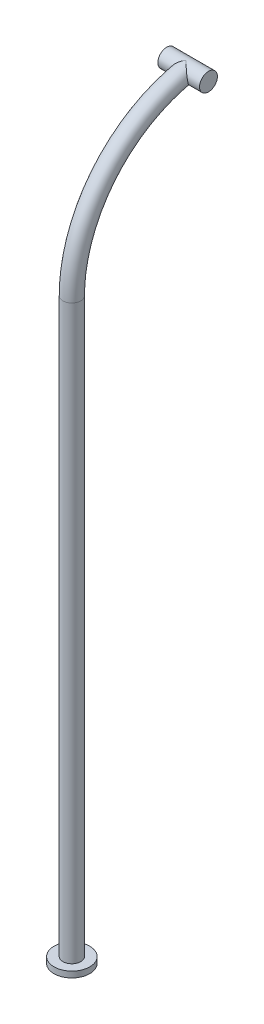
ISO-10303-21;
HEADER;
FILE_DESCRIPTION(('STEP AP214'),'2;1');
FILE_NAME('part.step','',(''),(''),'','','');
FILE_SCHEMA(('AUTOMOTIVE_DESIGN { 1 0 10303 214 1 1 1 1 }'));
ENDSEC;
DATA;
#1=APPLICATION_CONTEXT('core data for automotive mechanical design processes');
#2=APPLICATION_PROTOCOL_DEFINITION('international standard','automotive_design',2000,#1);
#3=PRODUCT_CONTEXT('',#1,'mechanical');
#4=PRODUCT('Part','Part','',(#3));
#5=PRODUCT_RELATED_PRODUCT_CATEGORY('part','',(#4));
#6=PRODUCT_DEFINITION_FORMATION('','',#4);
#7=PRODUCT_DEFINITION_CONTEXT('part definition',#1,'design');
#8=PRODUCT_DEFINITION('design','',#6,#7);
#9=PRODUCT_DEFINITION_SHAPE('','',#8);
#10=(LENGTH_UNIT() NAMED_UNIT(*) SI_UNIT(.MILLI.,.METRE.));
#11=(NAMED_UNIT(*) PLANE_ANGLE_UNIT() SI_UNIT($,.RADIAN.));
#12=(NAMED_UNIT(*) SI_UNIT($,.STERADIAN.) SOLID_ANGLE_UNIT());
#13=UNCERTAINTY_MEASURE_WITH_UNIT(LENGTH_MEASURE(1.E-05),#10,'distance_accuracy_value','');
#14=(GEOMETRIC_REPRESENTATION_CONTEXT(3) GLOBAL_UNCERTAINTY_ASSIGNED_CONTEXT((#13)) GLOBAL_UNIT_ASSIGNED_CONTEXT((#10,
#11,#12)) REPRESENTATION_CONTEXT('',''));
#15=CARTESIAN_POINT('',(0.,0.,0.));
#16=DIRECTION('',(0.,0.,1.));
#17=DIRECTION('',(1.,0.,0.));
#18=AXIS2_PLACEMENT_3D('',#15,#16,#17);
#19=CARTESIAN_POINT('',(0.,96.,0.));
#20=DIRECTION('',(0.,-1.,0.));
#21=DIRECTION('',(0.,0.,-1.));
#22=AXIS2_PLACEMENT_3D('',#19,#20,#21);
#23=CYLINDRICAL_SURFACE('',#22,1.5);
#24=CARTESIAN_POINT('',(0.,96.,0.));
#25=DIRECTION('',(0.,1.,0.));
#26=DIRECTION('',(0.,0.,1.));
#27=AXIS2_PLACEMENT_3D('',#24,#25,#26);
#28=CIRCLE('',#27,1.5);
#29=CARTESIAN_POINT('',(0.,96.,1.5));
#30=VERTEX_POINT('',#29);
#31=EDGE_CURVE('E11',#30,#30,#28,.T.);
#32=ORIENTED_EDGE('',*,*,#31,.F.);
#33=EDGE_LOOP('',(#32));
#34=FACE_BOUND('',#33,.T.);
#35=CARTESIAN_POINT('',(0.,0.,0.));
#36=DIRECTION('',(0.,1.,0.));
#37=DIRECTION('',(0.,0.,1.));
#38=AXIS2_PLACEMENT_3D('',#35,#36,#37);
#39=CIRCLE('',#38,1.5);
#40=CARTESIAN_POINT('',(0.,0.,1.5));
#41=VERTEX_POINT('',#40);
#42=EDGE_CURVE('E38',#41,#41,#39,.T.);
#43=ORIENTED_EDGE('',*,*,#42,.T.);
#44=EDGE_LOOP('',(#43));
#45=FACE_BOUND('',#44,.T.);
#46=ADVANCED_FACE('F35',(#34,#45),#23,.T.);
#47=CARTESIAN_POINT('',(0.,-1.,0.));
#48=DIRECTION('',(0.,1.,0.));
#49=DIRECTION('',(0.,0.,1.));
#50=AXIS2_PLACEMENT_3D('',#47,#48,#49);
#51=CYLINDRICAL_SURFACE('',#50,3.);
#52=CARTESIAN_POINT('',(0.,-1.,0.));
#53=DIRECTION('',(0.,-1.,0.));
#54=DIRECTION('',(0.,0.,-1.));
#55=AXIS2_PLACEMENT_3D('',#52,#53,#54);
#56=CIRCLE('',#55,3.);
#57=CARTESIAN_POINT('',(0.,-1.,-3.));
#58=VERTEX_POINT('',#57);
#59=EDGE_CURVE('E60',#58,#58,#56,.T.);
#60=ORIENTED_EDGE('',*,*,#59,.F.);
#61=EDGE_LOOP('',(#60));
#62=FACE_BOUND('',#61,.T.);
#63=CARTESIAN_POINT('',(0.,0.,0.));
#64=DIRECTION('',(0.,-1.,0.));
#65=DIRECTION('',(0.,0.,-1.));
#66=AXIS2_PLACEMENT_3D('',#63,#64,#65);
#67=CIRCLE('',#66,3.);
#68=CARTESIAN_POINT('',(0.,0.,-3.));
#69=VERTEX_POINT('',#68);
#70=EDGE_CURVE('E57',#69,#69,#67,.T.);
#71=ORIENTED_EDGE('',*,*,#70,.T.);
#72=EDGE_LOOP('',(#71));
#73=FACE_BOUND('',#72,.T.);
#74=ADVANCED_FACE('F90',(#62,#73),#51,.T.);
#75=CARTESIAN_POINT('',(0.,-1.,0.));
#76=DIRECTION('',(0.,-1.,0.));
#77=DIRECTION('',(0.,0.,-1.));
#78=AXIS2_PLACEMENT_3D('',#75,#76,#77);
#79=PLANE('',#78);
#80=ORIENTED_EDGE('',*,*,#59,.T.);
#81=EDGE_LOOP('',(#80));
#82=FACE_BOUND('',#81,.T.);
#83=ADVANCED_FACE('F95',(#82),#79,.T.);
#84=CARTESIAN_POINT('',(0.,0.,0.));
#85=DIRECTION('',(0.,-1.,0.));
#86=DIRECTION('',(0.,0.,-1.));
#87=AXIS2_PLACEMENT_3D('',#84,#85,#86);
#88=PLANE('',#87);
#89=ORIENTED_EDGE('',*,*,#42,.F.);
#90=EDGE_LOOP('',(#89));
#91=FACE_BOUND('',#90,.T.);
#92=ORIENTED_EDGE('',*,*,#70,.F.);
#93=EDGE_LOOP('',(#92));
#94=FACE_BOUND('',#93,.T.);
#95=ADVANCED_FACE('F108',(#91,#94),#88,.F.);
#96=CARTESIAN_POINT('',(0.,96.,-23.5));
#97=DIRECTION('',(1.,0.,0.));
#98=DIRECTION('',(0.,0.,-1.));
#99=AXIS2_PLACEMENT_3D('',#96,#97,#98);
#100=TOROIDAL_SURFACE('',#99,23.5,1.5);
#101=CARTESIAN_POINT('',(0.,120.620193825305,-19.1587955583268));
#102=CARTESIAN_POINT('',(-0.0018537052535478,120.619861811997,-19.1569126554162));
#103=CARTESIAN_POINT('',(-0.00370746798024509,120.619526195106,-19.1550303276243));
#104=CARTESIAN_POINT('',(-0.115881057773662,120.599000089099,-19.0411666480332));
#105=CARTESIAN_POINT('',(-0.226377501892855,120.566052234373,-18.9312538632642));
#106=CARTESIAN_POINT('',(-0.444772916299563,120.474622358396,-18.719185892713));
#107=CARTESIAN_POINT('',(-0.552665436072186,120.416082668296,-18.6170488427425));
#108=CARTESIAN_POINT('',(-0.734320155371233,120.291643885346,-18.450591252963));
#109=CARTESIAN_POINT('',(-0.809576325178854,120.231762220571,-18.3834034109835));
#110=CARTESIAN_POINT('',(-0.954392096067578,120.097278091331,-18.2583525801813));
#111=CARTESIAN_POINT('',(-1.02396394077776,120.022708513128,-18.2004692749422));
#112=CARTESIAN_POINT('',(-1.13745535009243,119.879851990233,-18.1107660185354));
#113=CARTESIAN_POINT('',(-1.18335127624714,119.814942007049,-18.0760787666043));
#114=CARTESIAN_POINT('',(-1.26851571888151,119.677082479366,-18.0155642587893));
#115=CARTESIAN_POINT('',(-1.30779253587496,119.604143196543,-17.9897258636069));
#116=CARTESIAN_POINT('',(-1.370200858334,119.466918252286,-17.9533155103886));
#117=CARTESIAN_POINT('',(-1.39499155518931,119.403937274703,-17.9406968609073));
#118=CARTESIAN_POINT('',(-1.43752022044973,119.274542506387,-17.9236276863551));
#119=CARTESIAN_POINT('',(-1.45526275956153,119.208130972044,-17.9191718609258));
#120=CARTESIAN_POINT('',(-1.48246750306033,119.073069266053,-17.9193675436886));
#121=CARTESIAN_POINT('',(-1.49186701760018,119.004406100137,-17.9240871666456));
#122=CARTESIAN_POINT('',(-1.50120471128907,118.867772155485,-17.9431220038185));
#123=CARTESIAN_POINT('',(-1.5011487811936,118.799800972044,-17.9574312381576));
#124=CARTESIAN_POINT('',(-1.49206503096275,118.675146340182,-17.9927974484165));
#125=CARTESIAN_POINT('',(-1.48411659008736,118.618088240753,-18.0128364353358));
#126=CARTESIAN_POINT('',(-1.46132153450782,118.507972494756,-18.0590001867476));
#127=CARTESIAN_POINT('',(-1.44647398975484,118.454915388671,-18.0851257715204));
#128=CARTESIAN_POINT('',(-1.41025341699855,118.352460291901,-18.1430884490756));
#129=CARTESIAN_POINT('',(-1.38871871218166,118.303195601842,-18.1750579301856));
#130=CARTESIAN_POINT('',(-1.34033809671886,118.210406190437,-18.242996192529));
#131=CARTESIAN_POINT('',(-1.31348966141162,118.166884214017,-18.278966871241));
#132=CARTESIAN_POINT('',(-1.23969169167345,118.063530443827,-18.3742498913955));
#133=CARTESIAN_POINT('',(-1.18975434313812,118.007711842341,-18.4356120184566));
#134=CARTESIAN_POINT('',(-1.08267213410527,117.909140910077,-18.5624589673256));
#135=CARTESIAN_POINT('',(-1.02550803418719,117.86642454109,-18.6279545513095));
#136=CARTESIAN_POINT('',(-0.881553762660521,117.777739851887,-18.788650154918));
#137=CARTESIAN_POINT('',(-0.79229561778328,117.737745772154,-18.8849227914431));
#138=CARTESIAN_POINT('',(-0.608208741647366,117.678737759365,-19.0783531238493));
#139=CARTESIAN_POINT('',(-0.513376598013452,117.659736822114,-19.1755113304673));
#140=CARTESIAN_POINT('',(-0.349423328825955,117.643519449176,-19.340090213541));
#141=CARTESIAN_POINT('',(-0.281002385861977,117.64151895342,-19.4077989140209));
#142=CARTESIAN_POINT('',(-0.143563831408559,117.646512541199,-19.5420846724762));
#143=CARTESIAN_POINT('',(-0.0745474755515862,117.653490869675,-19.6086635055255));
#144=CARTESIAN_POINT('',(-0.00371115619363194,117.665150215364,-19.6762033204509));
#145=CARTESIAN_POINT('',(-0.0018555613702252,117.66545880869,-19.6779720012932));
#146=CARTESIAN_POINT('',(0.,117.665770566269,-19.6797400913276));
#147=B_SPLINE_CURVE_WITH_KNOTS('',3,(#101,#102,#103,#104,#105,#106,#107,#108,#109,#110,#111,
#112,#113,#114,#115,#116,#117,#118,#119,#120,#121,#122,#123,#124,#125,#126,#127,#128,#129,#130,
#131,#132,#133,#134,#135,#136,#137,#138,#139,#140,#141,#142,#143,#144,#145,#146),.UNSPECIFIED.,
.F.,.F.,(4,2,2,2,2,2,2,2,2,2,2,2,2,2,2,2,2,2,2,2,2,2,4),(0.,0.00798936214706331,
0.483433668523633,0.959954912275898,1.31074225810984,1.66075294007193,1.9200896299772,
2.17909864592695,2.38484781402027,2.59046333579286,2.79761109261149,3.00462979655792,
3.1867613964182,3.36891755605437,3.55587477748474,3.74292104025734,4.03175669373832,
4.32137816528414,4.73089511210548,5.14066542860265,5.42911908157095,5.71706727723055,
5.72481324995939),.UNSPECIFIED.);
#148=CARTESIAN_POINT('',(0.,120.620193825305,-19.1587955583268));
#149=VERTEX_POINT('',#148);
#150=CARTESIAN_POINT('',(0.,117.665770566269,-19.6797400913276));
#151=VERTEX_POINT('',#150);
#152=EDGE_CURVE('E50',#149,#151,#147,.T.);
#153=ORIENTED_EDGE('',*,*,#152,.T.);
#154=CARTESIAN_POINT('',(0.,117.665770566269,-19.6797400913276));
#155=CARTESIAN_POINT('',(0.00185551671662992,117.665458822323,-19.6779720428394));
#156=CARTESIAN_POINT('',(0.00371111186187556,117.665150228725,-19.6762033617294));
#157=CARTESIAN_POINT('',(0.12602131042256,117.645018109903,-19.5595851690684));
#158=CARTESIAN_POINT('',(0.246770009248978,117.638477851673,-19.4420989575472));
#159=CARTESIAN_POINT('',(0.424986802578416,117.649807022725,-19.2644784068306));
#160=CARTESIAN_POINT('',(0.48399809905577,117.657134790076,-19.2049454088842));
#161=CARTESIAN_POINT('',(0.600499902060489,117.67926655826,-19.0857966125935));
#162=CARTESIAN_POINT('',(0.657991376611415,117.694065673414,-19.0261808937156));
#163=CARTESIAN_POINT('',(0.788185045789324,117.737459646485,-18.8890175035039));
#164=CARTESIAN_POINT('',(0.860113578591412,117.768900775206,-18.8116065409692));
#165=CARTESIAN_POINT('',(0.997981398084005,117.846963966027,-18.6592420316256));
#166=CARTESIAN_POINT('',(1.06393382962462,117.893551622103,-18.5842833351729));
#167=CARTESIAN_POINT('',(1.17144756656531,117.989855276253,-18.4575233246697));
#168=CARTESIAN_POINT('',(1.21498662401479,118.035883616443,-18.4046142493622));
#169=CARTESIAN_POINT('',(1.29511239442943,118.138016435008,-18.3033852553755));
#170=CARTESIAN_POINT('',(1.33170782286599,118.194108107671,-18.2550596223125));
#171=CARTESIAN_POINT('',(1.38932043184395,118.304152186474,-18.174256195726));
#172=CARTESIAN_POINT('',(1.41198789127558,118.356320267771,-18.1405365510623));
#173=CARTESIAN_POINT('',(1.45013986733255,118.466472054275,-18.0790054925247));
#174=CARTESIAN_POINT('',(1.46562951700792,118.524451567366,-18.0511898642644));
#175=CARTESIAN_POINT('',(1.48845117293184,118.645292682077,-18.0027358152113));
#176=CARTESIAN_POINT('',(1.4957354808542,118.708180580152,-17.9821398346347));
#177=CARTESIAN_POINT('',(1.50146155242806,118.83651192316,-17.9494186927207));
#178=CARTESIAN_POINT('',(1.49990519431048,118.90195482234,-17.9372917327245));
#179=CARTESIAN_POINT('',(1.48875406484943,119.026994290206,-17.9225570181584));
#180=CARTESIAN_POINT('',(1.4799158603276,119.086571926392,-17.9191727631652));
#181=CARTESIAN_POINT('',(1.455835607311,119.204383056781,-17.919367037355));
#182=CARTESIAN_POINT('',(1.44059247214326,119.262616321126,-17.9229467484321));
#183=CARTESIAN_POINT('',(1.40345802837158,119.380139159514,-17.9368788782709));
#184=CARTESIAN_POINT('',(1.38120881430048,119.439264723177,-17.9476431956137));
#185=CARTESIAN_POINT('',(1.33160276723544,119.55376153232,-17.9754056116038));
#186=CARTESIAN_POINT('',(1.30424295874169,119.609130564934,-17.9924073474002));
#187=CARTESIAN_POINT('',(1.22943222577785,119.744579954342,-18.0424045343333));
#188=CARTESIAN_POINT('',(1.17914030804177,119.821747643954,-18.0790712503376));
#189=CARTESIAN_POINT('',(1.07172665770131,119.965425688383,-18.1620865204402));
#190=CARTESIAN_POINT('',(1.01458808435472,120.031908782353,-18.2084591662491));
#191=CARTESIAN_POINT('',(0.874627311643324,120.175811239849,-18.3262465951938));
#192=CARTESIAN_POINT('',(0.789854153097809,120.248818069592,-18.4007252282576));
#193=CARTESIAN_POINT('',(0.615284337005814,120.376015811099,-18.5590636238579));
#194=CARTESIAN_POINT('',(0.525484849331907,120.430195996028,-18.6429286986395));
#195=CARTESIAN_POINT('',(0.363888887597706,120.510106678053,-18.797399522479));
#196=CARTESIAN_POINT('',(0.292619514576809,120.539501096165,-18.8667083673093));
#197=CARTESIAN_POINT('',(0.149402808833266,120.587452983427,-19.0080961851971));
#198=CARTESIAN_POINT('',(0.0774570219428874,120.606030941486,-19.0801696434429));
#199=CARTESIAN_POINT('',(0.00370748452012608,120.619526196649,-19.1550303099391));
#200=CARTESIAN_POINT('',(0.0018537217189263,120.619861813736,-19.1569126377718));
#201=CARTESIAN_POINT('',(0.,120.620193825305,-19.1587955583268));
#202=B_SPLINE_CURVE_WITH_KNOTS('',3,(#154,#155,#156,#157,#158,#159,#160,#161,#162,#163,#164,
#165,#166,#167,#168,#169,#170,#171,#172,#173,#174,#175,#176,#177,#178,#179,#180,#181,#182,#183,
#184,#185,#186,#187,#188,#189,#190,#191,#192,#193,#194,#195,#196,#197,#198,#199,#200,#201),
.UNSPECIFIED.,.F.,.F.,(4,2,2,2,2,2,2,2,2,2,2,2,2,2,2,2,2,2,2,2,2,2,2,4),(0.,0.00774597272883874,
0.510550925507701,0.762744102519317,1.0147725780536,1.34448431879618,1.67345227677967,
1.92025492326559,2.16674570967238,2.36432239054724,2.56175755999878,2.7603346072177,
2.95886946761519,3.13904707804884,3.31925527011691,3.51080021272671,3.70245702657631,
3.9982127697321,4.29471152310557,4.69578076395294,5.09707814829994,5.40751942146165,
5.71737071669235,5.72536007883942),.UNSPECIFIED.);
#203=EDGE_CURVE('E48',#151,#149,#202,.T.);
#204=ORIENTED_EDGE('',*,*,#203,.T.);
#205=EDGE_LOOP('',(#153,#204));
#206=FACE_BOUND('',#205,.T.);
#207=ORIENTED_EDGE('',*,*,#31,.T.);
#208=EDGE_LOOP('',(#207));
#209=FACE_BOUND('',#208,.T.);
#210=ADVANCED_FACE('F55',(#206,#209),#100,.T.);
#211=CARTESIAN_POINT('',(-3.5,119.142982195787,-19.4192678248272));
#212=DIRECTION('',(1.,0.,0.));
#213=DIRECTION('',(0.,0.,-1.));
#214=AXIS2_PLACEMENT_3D('',#211,#212,#213);
#215=CYLINDRICAL_SURFACE('',#214,1.5);
#216=CARTESIAN_POINT('',(3.5,119.142982195787,-19.4192678248272));
#217=DIRECTION('',(1.,0.,0.));
#218=DIRECTION('',(0.,0.,-1.));
#219=AXIS2_PLACEMENT_3D('',#216,#217,#218);
#220=CIRCLE('',#219,1.5);
#221=CARTESIAN_POINT('',(3.5,119.142982195787,-20.9192678248272));
#222=VERTEX_POINT('',#221);
#223=EDGE_CURVE('E158',#222,#222,#220,.T.);
#224=ORIENTED_EDGE('',*,*,#223,.F.);
#225=EDGE_LOOP('',(#224));
#226=FACE_BOUND('',#225,.T.);
#227=CARTESIAN_POINT('',(-3.5,119.142982195787,-19.4192678248272));
#228=DIRECTION('',(1.,0.,0.));
#229=DIRECTION('',(0.,0.,-1.));
#230=AXIS2_PLACEMENT_3D('',#227,#228,#229);
#231=CIRCLE('',#230,1.5);
#232=CARTESIAN_POINT('',(-3.5,119.142982195787,-20.9192678248272));
#233=VERTEX_POINT('',#232);
#234=EDGE_CURVE('E53',#233,#233,#231,.T.);
#235=ORIENTED_EDGE('',*,*,#234,.T.);
#236=EDGE_LOOP('',(#235));
#237=FACE_BOUND('',#236,.T.);
#238=ORIENTED_EDGE('',*,*,#203,.F.);
#239=ORIENTED_EDGE('',*,*,#152,.F.);
#240=EDGE_LOOP('',(#238,#239));
#241=FACE_BOUND('',#240,.T.);
#242=ADVANCED_FACE('F51',(#226,#237,#241),#215,.T.);
#243=CARTESIAN_POINT('',(-3.5,119.142982195787,-19.4192678248272));
#244=DIRECTION('',(1.,0.,0.));
#245=DIRECTION('',(0.,0.,-1.));
#246=AXIS2_PLACEMENT_3D('',#243,#244,#245);
#247=PLANE('',#246);
#248=ORIENTED_EDGE('',*,*,#234,.F.);
#249=EDGE_LOOP('',(#248));
#250=FACE_BOUND('',#249,.T.);
#251=ADVANCED_FACE('F77',(#250),#247,.F.);
#252=CARTESIAN_POINT('',(3.5,119.142982195787,-19.4192678248272));
#253=DIRECTION('',(1.,0.,0.));
#254=DIRECTION('',(0.,0.,-1.));
#255=AXIS2_PLACEMENT_3D('',#252,#253,#254);
#256=PLANE('',#255);
#257=ORIENTED_EDGE('',*,*,#223,.T.);
#258=EDGE_LOOP('',(#257));
#259=FACE_BOUND('',#258,.T.);
#260=ADVANCED_FACE('F82',(#259),#256,.T.);
#261=CLOSED_SHELL('',(#46,#74,#83,#95,#210,#242,#251,#260));
#262=MANIFOLD_SOLID_BREP('B2',#261);
#263=ADVANCED_BREP_SHAPE_REPRESENTATION('',(#18,#262),#14);
#264=SHAPE_DEFINITION_REPRESENTATION(#9,#263);
ENDSEC;
END-ISO-10303-21;
